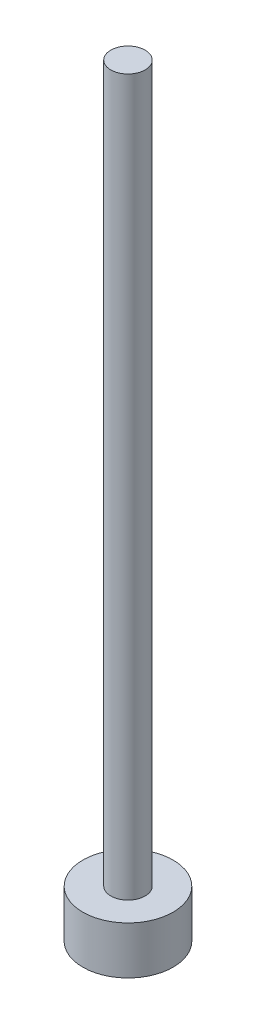
ISO-10303-21;
HEADER;
FILE_DESCRIPTION(('STEP AP214'),'2;1');
FILE_NAME('part.step','',(''),(''),'','','');
FILE_SCHEMA(('AUTOMOTIVE_DESIGN { 1 0 10303 214 1 1 1 1 }'));
ENDSEC;
DATA;
#1=APPLICATION_CONTEXT('core data for automotive mechanical design processes');
#2=APPLICATION_PROTOCOL_DEFINITION('international standard','automotive_design',2000,#1);
#3=PRODUCT_CONTEXT('',#1,'mechanical');
#4=PRODUCT('Part','Part','',(#3));
#5=PRODUCT_RELATED_PRODUCT_CATEGORY('part','',(#4));
#6=PRODUCT_DEFINITION_FORMATION('','',#4);
#7=PRODUCT_DEFINITION_CONTEXT('part definition',#1,'design');
#8=PRODUCT_DEFINITION('design','',#6,#7);
#9=PRODUCT_DEFINITION_SHAPE('','',#8);
#10=(LENGTH_UNIT() NAMED_UNIT(*) SI_UNIT(.MILLI.,.METRE.));
#11=(NAMED_UNIT(*) PLANE_ANGLE_UNIT() SI_UNIT($,.RADIAN.));
#12=(NAMED_UNIT(*) SI_UNIT($,.STERADIAN.) SOLID_ANGLE_UNIT());
#13=UNCERTAINTY_MEASURE_WITH_UNIT(LENGTH_MEASURE(1.E-05),#10,'distance_accuracy_value','');
#14=(GEOMETRIC_REPRESENTATION_CONTEXT(3) GLOBAL_UNCERTAINTY_ASSIGNED_CONTEXT((#13)) GLOBAL_UNIT_ASSIGNED_CONTEXT((#10,
#11,#12)) REPRESENTATION_CONTEXT('',''));
#15=CARTESIAN_POINT('',(0.,0.,0.));
#16=DIRECTION('',(0.,0.,1.));
#17=DIRECTION('',(1.,0.,0.));
#18=AXIS2_PLACEMENT_3D('',#15,#16,#17);
#19=CARTESIAN_POINT('',(0.,3.,0.));
#20=DIRECTION('',(0.,-1.,0.));
#21=DIRECTION('',(0.,0.,-1.));
#22=AXIS2_PLACEMENT_3D('',#19,#20,#21);
#23=CYLINDRICAL_SURFACE('',#22,2.84);
#24=CARTESIAN_POINT('',(0.,3.,0.));
#25=DIRECTION('',(0.,1.,0.));
#26=DIRECTION('',(0.,0.,1.));
#27=AXIS2_PLACEMENT_3D('',#24,#25,#26);
#28=CIRCLE('',#27,2.84);
#29=CARTESIAN_POINT('',(0.,3.,2.84));
#30=VERTEX_POINT('',#29);
#31=EDGE_CURVE('E42',#30,#30,#28,.T.);
#32=ORIENTED_EDGE('',*,*,#31,.F.);
#33=EDGE_LOOP('',(#32));
#34=FACE_BOUND('',#33,.T.);
#35=CARTESIAN_POINT('',(0.,0.,0.));
#36=DIRECTION('',(0.,1.,0.));
#37=DIRECTION('',(0.,0.,1.));
#38=AXIS2_PLACEMENT_3D('',#35,#36,#37);
#39=CIRCLE('',#38,2.84);
#40=CARTESIAN_POINT('',(0.,0.,2.84));
#41=VERTEX_POINT('',#40);
#42=EDGE_CURVE('E37',#41,#41,#39,.T.);
#43=ORIENTED_EDGE('',*,*,#42,.T.);
#44=EDGE_LOOP('',(#43));
#45=FACE_BOUND('',#44,.T.);
#46=ADVANCED_FACE('F34',(#34,#45),#23,.T.);
#47=CARTESIAN_POINT('',(0.,3.,0.));
#48=DIRECTION('',(0.,1.,0.));
#49=DIRECTION('',(0.,0.,1.));
#50=AXIS2_PLACEMENT_3D('',#47,#48,#49);
#51=PLANE('',#50);
#52=CARTESIAN_POINT('',(0.,3.,0.));
#53=DIRECTION('',(0.,1.,0.));
#54=DIRECTION('',(0.,0.,1.));
#55=AXIS2_PLACEMENT_3D('',#52,#53,#54);
#56=CIRCLE('',#55,1.07969664843992);
#57=CARTESIAN_POINT('',(0.,3.,-1.07969664843992));
#58=VERTEX_POINT('',#57);
#59=EDGE_CURVE('E11',#58,#58,#56,.T.);
#60=ORIENTED_EDGE('',*,*,#59,.F.);
#61=EDGE_LOOP('',(#60));
#62=FACE_BOUND('',#61,.T.);
#63=ORIENTED_EDGE('',*,*,#31,.T.);
#64=EDGE_LOOP('',(#63));
#65=FACE_BOUND('',#64,.T.);
#66=ADVANCED_FACE('F154',(#62,#65),#51,.T.);
#67=CARTESIAN_POINT('',(0.,0.,0.));
#68=DIRECTION('',(0.,1.,0.));
#69=DIRECTION('',(0.,0.,1.));
#70=AXIS2_PLACEMENT_3D('',#67,#68,#69);
#71=PLANE('',#70);
#72=DIRECTION('',(-0.5,0.,0.866025403784438));
#73=VECTOR('',#72,1.);
#74=CARTESIAN_POINT('',(1.65122176988233,0.,0.));
#75=LINE('',#74,#73);
#76=CARTESIAN_POINT('',(1.65122176988233,0.,0.));
#77=VERTEX_POINT('',#76);
#78=CARTESIAN_POINT('',(0.825610884941164,0.,1.43));
#79=VERTEX_POINT('',#78);
#80=EDGE_CURVE('E124',#77,#79,#75,.T.);
#81=ORIENTED_EDGE('',*,*,#80,.F.);
#82=DIRECTION('',(0.5,0.,0.866025403784439));
#83=VECTOR('',#82,1.);
#84=CARTESIAN_POINT('',(0.825610884941165,0.,-1.43));
#85=LINE('',#84,#83);
#86=CARTESIAN_POINT('',(0.825610884941165,0.,-1.43));
#87=VERTEX_POINT('',#86);
#88=EDGE_CURVE('E50',#87,#77,#85,.T.);
#89=ORIENTED_EDGE('',*,*,#88,.F.);
#90=DIRECTION('',(1.,0.,0.));
#91=VECTOR('',#90,1.);
#92=CARTESIAN_POINT('',(-0.825610884941164,0.,-1.43));
#93=LINE('',#92,#91);
#94=CARTESIAN_POINT('',(-0.825610884941164,0.,-1.43));
#95=VERTEX_POINT('',#94);
#96=EDGE_CURVE('E133',#95,#87,#93,.T.);
#97=ORIENTED_EDGE('',*,*,#96,.F.);
#98=DIRECTION('',(0.5,0.,-0.866025403784439));
#99=VECTOR('',#98,1.);
#100=CARTESIAN_POINT('',(-1.65122176988233,0.,0.));
#101=LINE('',#100,#99);
#102=CARTESIAN_POINT('',(-1.65122176988233,0.,0.));
#103=VERTEX_POINT('',#102);
#104=EDGE_CURVE('E131',#103,#95,#101,.T.);
#105=ORIENTED_EDGE('',*,*,#104,.F.);
#106=DIRECTION('',(-0.5,0.,-0.866025403784439));
#107=VECTOR('',#106,1.);
#108=CARTESIAN_POINT('',(-0.825610884941164,0.,1.43));
#109=LINE('',#108,#107);
#110=CARTESIAN_POINT('',(-0.825610884941164,0.,1.43));
#111=VERTEX_POINT('',#110);
#112=EDGE_CURVE('E98',#111,#103,#109,.T.);
#113=ORIENTED_EDGE('',*,*,#112,.F.);
#114=DIRECTION('',(-1.,0.,0.));
#115=VECTOR('',#114,1.);
#116=CARTESIAN_POINT('',(0.825610884941164,0.,1.43));
#117=LINE('',#116,#115);
#118=EDGE_CURVE('E127',#79,#111,#117,.T.);
#119=ORIENTED_EDGE('',*,*,#118,.F.);
#120=EDGE_LOOP('',(#81,#89,#97,#105,#113,#119));
#121=FACE_BOUND('',#120,.T.);
#122=ORIENTED_EDGE('',*,*,#42,.F.);
#123=EDGE_LOOP('',(#122));
#124=FACE_BOUND('',#123,.T.);
#125=ADVANCED_FACE('F151',(#121,#124),#71,.F.);
#126=CARTESIAN_POINT('',(0.,48.,0.));
#127=DIRECTION('',(0.,-1.,0.));
#128=DIRECTION('',(0.,0.,-1.));
#129=AXIS2_PLACEMENT_3D('',#126,#127,#128);
#130=CYLINDRICAL_SURFACE('',#129,1.07969664843992);
#131=CARTESIAN_POINT('',(0.,48.,0.));
#132=DIRECTION('',(0.,1.,0.));
#133=DIRECTION('',(0.,0.,1.));
#134=AXIS2_PLACEMENT_3D('',#131,#132,#133);
#135=CIRCLE('',#134,1.07969664843992);
#136=CARTESIAN_POINT('',(0.,48.,-1.07969664843992));
#137=VERTEX_POINT('',#136);
#138=EDGE_CURVE('E137',#137,#137,#135,.T.);
#139=CARTESIAN_POINT('',(0.,48.,-1.07969664843992));
#140=CARTESIAN_POINT('',(0.,47.53125,-1.07969664843992));
#141=CARTESIAN_POINT('',(0.,47.0625,-1.07969664843992));
#142=CARTESIAN_POINT('',(0.,46.125,-1.07969664843992));
#143=CARTESIAN_POINT('',(0.,45.65625,-1.07969664843992));
#144=CARTESIAN_POINT('',(0.,44.71875,-1.07969664843992));
#145=CARTESIAN_POINT('',(0.,44.25,-1.07969664843992));
#146=CARTESIAN_POINT('',(0.,43.3125,-1.07969664843992));
#147=CARTESIAN_POINT('',(0.,42.84375,-1.07969664843992));
#148=CARTESIAN_POINT('',(0.,41.90625,-1.07969664843992));
#149=CARTESIAN_POINT('',(0.,41.4375,-1.07969664843992));
#150=CARTESIAN_POINT('',(0.,40.5,-1.07969664843992));
#151=CARTESIAN_POINT('',(0.,40.03125,-1.07969664843992));
#152=CARTESIAN_POINT('',(0.,39.09375,-1.07969664843992));
#153=CARTESIAN_POINT('',(0.,38.625,-1.07969664843992));
#154=CARTESIAN_POINT('',(0.,37.6875,-1.07969664843992));
#155=CARTESIAN_POINT('',(0.,37.21875,-1.07969664843992));
#156=CARTESIAN_POINT('',(0.,36.28125,-1.07969664843992));
#157=CARTESIAN_POINT('',(0.,35.8125,-1.07969664843992));
#158=CARTESIAN_POINT('',(0.,34.875,-1.07969664843992));
#159=CARTESIAN_POINT('',(0.,34.40625,-1.07969664843992));
#160=CARTESIAN_POINT('',(0.,33.46875,-1.07969664843992));
#161=CARTESIAN_POINT('',(0.,33.,-1.07969664843992));
#162=CARTESIAN_POINT('',(0.,32.0625,-1.07969664843992));
#163=CARTESIAN_POINT('',(0.,31.59375,-1.07969664843992));
#164=CARTESIAN_POINT('',(0.,30.65625,-1.07969664843992));
#165=CARTESIAN_POINT('',(0.,30.1875,-1.07969664843992));
#166=CARTESIAN_POINT('',(0.,29.25,-1.07969664843992));
#167=CARTESIAN_POINT('',(0.,28.78125,-1.07969664843992));
#168=CARTESIAN_POINT('',(0.,27.84375,-1.07969664843992));
#169=CARTESIAN_POINT('',(0.,27.375,-1.07969664843992));
#170=CARTESIAN_POINT('',(0.,26.4375,-1.07969664843992));
#171=CARTESIAN_POINT('',(0.,25.96875,-1.07969664843992));
#172=CARTESIAN_POINT('',(0.,25.03125,-1.07969664843992));
#173=CARTESIAN_POINT('',(0.,24.5625,-1.07969664843992));
#174=CARTESIAN_POINT('',(0.,23.625,-1.07969664843992));
#175=CARTESIAN_POINT('',(0.,23.15625,-1.07969664843992));
#176=CARTESIAN_POINT('',(0.,22.21875,-1.07969664843992));
#177=CARTESIAN_POINT('',(0.,21.75,-1.07969664843992));
#178=CARTESIAN_POINT('',(0.,20.8125,-1.07969664843992));
#179=CARTESIAN_POINT('',(0.,20.34375,-1.07969664843992));
#180=CARTESIAN_POINT('',(0.,19.40625,-1.07969664843992));
#181=CARTESIAN_POINT('',(0.,18.9375,-1.07969664843992));
#182=CARTESIAN_POINT('',(0.,18.,-1.07969664843992));
#183=CARTESIAN_POINT('',(0.,17.53125,-1.07969664843992));
#184=CARTESIAN_POINT('',(0.,16.59375,-1.07969664843992));
#185=CARTESIAN_POINT('',(0.,16.125,-1.07969664843992));
#186=CARTESIAN_POINT('',(0.,15.1875,-1.07969664843992));
#187=CARTESIAN_POINT('',(0.,14.71875,-1.07969664843992));
#188=CARTESIAN_POINT('',(0.,13.78125,-1.07969664843992));
#189=CARTESIAN_POINT('',(0.,13.3125,-1.07969664843992));
#190=CARTESIAN_POINT('',(0.,12.375,-1.07969664843992));
#191=CARTESIAN_POINT('',(0.,11.90625,-1.07969664843992));
#192=CARTESIAN_POINT('',(0.,10.96875,-1.07969664843992));
#193=CARTESIAN_POINT('',(0.,10.5,-1.07969664843992));
#194=CARTESIAN_POINT('',(0.,9.5625,-1.07969664843992));
#195=CARTESIAN_POINT('',(0.,9.09375,-1.07969664843992));
#196=CARTESIAN_POINT('',(0.,8.15625,-1.07969664843992));
#197=CARTESIAN_POINT('',(0.,7.6875,-1.07969664843992));
#198=CARTESIAN_POINT('',(0.,6.75,-1.07969664843992));
#199=CARTESIAN_POINT('',(0.,6.28125,-1.07969664843992));
#200=CARTESIAN_POINT('',(0.,5.34375,-1.07969664843992));
#201=CARTESIAN_POINT('',(0.,4.87499999999999,-1.07969664843992));
#202=CARTESIAN_POINT('',(0.,3.93749999999999,-1.07969664843992));
#203=CARTESIAN_POINT('',(0.,3.46875,-1.07969664843992));
#204=CARTESIAN_POINT('',(0.,3.,-1.07969664843992));
#205=B_SPLINE_CURVE_WITH_KNOTS('',3,(#139,#140,#141,#142,#143,#144,#145,#146,#147,#148,#149,
#150,#151,#152,#153,#154,#155,#156,#157,#158,#159,#160,#161,#162,#163,#164,#165,#166,#167,#168,
#169,#170,#171,#172,#173,#174,#175,#176,#177,#178,#179,#180,#181,#182,#183,#184,#185,#186,#187,
#188,#189,#190,#191,#192,#193,#194,#195,#196,#197,#198,#199,#200,#201,#202,#203,#204),
.UNSPECIFIED.,.F.,.F.,(4,2,2,2,2,2,2,2,2,2,2,2,2,2,2,2,2,2,2,2,2,2,2,2,2,2,2,2,2,2,2,2,4),(0.,
1.40625,2.8125,4.21875000000001,5.62500000000001,7.03125,8.4375,9.84375000000001,11.25,12.65625,
14.0625,15.46875,16.875,18.28125,19.6875,21.09375,22.5,23.90625,25.3125,26.71875,28.125,
29.53125,30.9375,32.34375,33.75,35.15625,36.5625,37.96875,39.375,40.78125,42.1875,43.59375,45.),.UNSPECIFIED.);
#206=EDGE_CURVE('BSEAM153',#137,#58,#205,.T.);
#207=ORIENTED_EDGE('',*,*,#138,.F.);
#208=ORIENTED_EDGE('',*,*,#59,.T.);
#209=ORIENTED_EDGE('',*,*,#206,.T.);
#210=ORIENTED_EDGE('',*,*,#206,.F.);
#211=EDGE_LOOP('',(#207,#209,#208,#210));
#212=FACE_BOUND('',#211,.T.);
#213=ADVANCED_FACE('F153',(#212),#130,.T.);
#214=CARTESIAN_POINT('',(0.,48.,0.));
#215=DIRECTION('',(0.,1.,0.));
#216=DIRECTION('',(0.,0.,1.));
#217=AXIS2_PLACEMENT_3D('',#214,#215,#216);
#218=PLANE('',#217);
#219=ORIENTED_EDGE('',*,*,#138,.T.);
#220=EDGE_LOOP('',(#219));
#221=FACE_BOUND('',#220,.T.);
#222=ADVANCED_FACE('F160',(#221),#218,.T.);
#223=CARTESIAN_POINT('',(0.825610884941165,1.4,-1.43));
#224=DIRECTION('',(0.866025403784439,0.,-0.5));
#225=DIRECTION('',(-0.5,0.,-0.866025403784439));
#226=AXIS2_PLACEMENT_3D('',#223,#224,#225);
#227=PLANE('',#226);
#228=ORIENTED_EDGE('',*,*,#88,.T.);
#229=DIRECTION('',(0.,-1.,0.));
#230=VECTOR('',#229,1.);
#231=CARTESIAN_POINT('',(1.65122176988233,1.4,0.));
#232=LINE('',#231,#230);
#233=CARTESIAN_POINT('',(1.65122176988233,1.4,0.));
#234=VERTEX_POINT('',#233);
#235=EDGE_CURVE('E80',#234,#77,#232,.T.);
#236=ORIENTED_EDGE('',*,*,#235,.F.);
#237=DIRECTION('',(0.5,0.,0.866025403784439));
#238=VECTOR('',#237,1.);
#239=CARTESIAN_POINT('',(0.825610884941165,1.4,-1.43));
#240=LINE('',#239,#238);
#241=CARTESIAN_POINT('',(0.825610884941165,1.4,-1.43));
#242=VERTEX_POINT('',#241);
#243=EDGE_CURVE('E135',#242,#234,#240,.T.);
#244=ORIENTED_EDGE('',*,*,#243,.F.);
#245=DIRECTION('',(0.,-1.,0.));
#246=VECTOR('',#245,1.);
#247=CARTESIAN_POINT('',(0.825610884941165,1.4,-1.43));
#248=LINE('',#247,#246);
#249=EDGE_CURVE('E58',#242,#87,#248,.T.);
#250=ORIENTED_EDGE('',*,*,#249,.T.);
#251=EDGE_LOOP('',(#228,#236,#244,#250));
#252=FACE_BOUND('',#251,.T.);
#253=ADVANCED_FACE('F189',(#252),#227,.F.);
#254=CARTESIAN_POINT('',(-0.825610884941164,1.4,-1.43));
#255=DIRECTION('',(0.,0.,-1.));
#256=DIRECTION('',(-1.,0.,0.));
#257=AXIS2_PLACEMENT_3D('',#254,#255,#256);
#258=PLANE('',#257);
#259=ORIENTED_EDGE('',*,*,#96,.T.);
#260=ORIENTED_EDGE('',*,*,#249,.F.);
#261=DIRECTION('',(1.,0.,0.));
#262=VECTOR('',#261,1.);
#263=CARTESIAN_POINT('',(-0.825610884941164,1.4,-1.43));
#264=LINE('',#263,#262);
#265=CARTESIAN_POINT('',(-0.825610884941164,1.4,-1.43));
#266=VERTEX_POINT('',#265);
#267=EDGE_CURVE('E110',#266,#242,#264,.T.);
#268=ORIENTED_EDGE('',*,*,#267,.F.);
#269=DIRECTION('',(0.,-1.,0.));
#270=VECTOR('',#269,1.);
#271=CARTESIAN_POINT('',(-0.825610884941164,1.4,-1.43));
#272=LINE('',#271,#270);
#273=EDGE_CURVE('E102',#266,#95,#272,.T.);
#274=ORIENTED_EDGE('',*,*,#273,.T.);
#275=EDGE_LOOP('',(#259,#260,#268,#274));
#276=FACE_BOUND('',#275,.T.);
#277=ADVANCED_FACE('F203',(#276),#258,.F.);
#278=CARTESIAN_POINT('',(-1.65122176988233,1.4,0.));
#279=DIRECTION('',(-0.866025403784438,0.,-0.5));
#280=DIRECTION('',(-0.5,0.,0.866025403784439));
#281=AXIS2_PLACEMENT_3D('',#278,#279,#280);
#282=PLANE('',#281);
#283=ORIENTED_EDGE('',*,*,#104,.T.);
#284=ORIENTED_EDGE('',*,*,#273,.F.);
#285=DIRECTION('',(0.5,0.,-0.866025403784439));
#286=VECTOR('',#285,1.);
#287=CARTESIAN_POINT('',(-1.65122176988233,1.4,0.));
#288=LINE('',#287,#286);
#289=CARTESIAN_POINT('',(-1.65122176988233,1.4,0.));
#290=VERTEX_POINT('',#289);
#291=EDGE_CURVE('E106',#290,#266,#288,.T.);
#292=ORIENTED_EDGE('',*,*,#291,.F.);
#293=DIRECTION('',(0.,-1.,0.));
#294=VECTOR('',#293,1.);
#295=CARTESIAN_POINT('',(-1.65122176988233,1.4,0.));
#296=LINE('',#295,#294);
#297=EDGE_CURVE('E91',#290,#103,#296,.T.);
#298=ORIENTED_EDGE('',*,*,#297,.T.);
#299=EDGE_LOOP('',(#283,#284,#292,#298));
#300=FACE_BOUND('',#299,.T.);
#301=ADVANCED_FACE('F107',(#300),#282,.F.);
#302=CARTESIAN_POINT('',(-0.825610884941164,1.4,1.43));
#303=DIRECTION('',(-0.866025403784439,0.,0.5));
#304=DIRECTION('',(0.5,0.,0.866025403784439));
#305=AXIS2_PLACEMENT_3D('',#302,#303,#304);
#306=PLANE('',#305);
#307=ORIENTED_EDGE('',*,*,#112,.T.);
#308=ORIENTED_EDGE('',*,*,#297,.F.);
#309=DIRECTION('',(-0.5,0.,-0.866025403784439));
#310=VECTOR('',#309,1.);
#311=CARTESIAN_POINT('',(-0.825610884941164,1.4,1.43));
#312=LINE('',#311,#310);
#313=CARTESIAN_POINT('',(-0.825610884941164,1.4,1.43));
#314=VERTEX_POINT('',#313);
#315=EDGE_CURVE('E95',#314,#290,#312,.T.);
#316=ORIENTED_EDGE('',*,*,#315,.F.);
#317=DIRECTION('',(0.,-1.,0.));
#318=VECTOR('',#317,1.);
#319=CARTESIAN_POINT('',(-0.825610884941164,1.4,1.43));
#320=LINE('',#319,#318);
#321=EDGE_CURVE('E103',#314,#111,#320,.T.);
#322=ORIENTED_EDGE('',*,*,#321,.T.);
#323=EDGE_LOOP('',(#307,#308,#316,#322));
#324=FACE_BOUND('',#323,.T.);
#325=ADVANCED_FACE('F93',(#324),#306,.F.);
#326=CARTESIAN_POINT('',(0.825610884941164,1.4,1.43));
#327=DIRECTION('',(0.,0.,1.));
#328=DIRECTION('',(1.,0.,0.));
#329=AXIS2_PLACEMENT_3D('',#326,#327,#328);
#330=PLANE('',#329);
#331=ORIENTED_EDGE('',*,*,#118,.T.);
#332=ORIENTED_EDGE('',*,*,#321,.F.);
#333=DIRECTION('',(-1.,0.,0.));
#334=VECTOR('',#333,1.);
#335=CARTESIAN_POINT('',(0.825610884941164,1.4,1.43));
#336=LINE('',#335,#334);
#337=CARTESIAN_POINT('',(0.825610884941164,1.4,1.43));
#338=VERTEX_POINT('',#337);
#339=EDGE_CURVE('E116',#338,#314,#336,.T.);
#340=ORIENTED_EDGE('',*,*,#339,.F.);
#341=DIRECTION('',(0.,-1.,0.));
#342=VECTOR('',#341,1.);
#343=CARTESIAN_POINT('',(0.825610884941164,1.4,1.43));
#344=LINE('',#343,#342);
#345=EDGE_CURVE('E140',#338,#79,#344,.T.);
#346=ORIENTED_EDGE('',*,*,#345,.T.);
#347=EDGE_LOOP('',(#331,#332,#340,#346));
#348=FACE_BOUND('',#347,.T.);
#349=ADVANCED_FACE('F228',(#348),#330,.F.);
#350=CARTESIAN_POINT('',(1.65122176988233,1.4,0.));
#351=DIRECTION('',(0.866025403784438,0.,0.5));
#352=DIRECTION('',(0.5,0.,-0.866025403784438));
#353=AXIS2_PLACEMENT_3D('',#350,#351,#352);
#354=PLANE('',#353);
#355=ORIENTED_EDGE('',*,*,#80,.T.);
#356=ORIENTED_EDGE('',*,*,#345,.F.);
#357=DIRECTION('',(-0.5,0.,0.866025403784438));
#358=VECTOR('',#357,1.);
#359=CARTESIAN_POINT('',(1.65122176988233,1.4,0.));
#360=LINE('',#359,#358);
#361=EDGE_CURVE('E118',#234,#338,#360,.T.);
#362=ORIENTED_EDGE('',*,*,#361,.F.);
#363=ORIENTED_EDGE('',*,*,#235,.T.);
#364=EDGE_LOOP('',(#355,#356,#362,#363));
#365=FACE_BOUND('',#364,.T.);
#366=ADVANCED_FACE('F237',(#365),#354,.F.);
#367=CARTESIAN_POINT('',(0.,1.4,0.));
#368=DIRECTION('',(0.,-1.,0.));
#369=DIRECTION('',(0.,0.,-1.));
#370=AXIS2_PLACEMENT_3D('',#367,#368,#369);
#371=PLANE('',#370);
#372=ORIENTED_EDGE('',*,*,#243,.T.);
#373=ORIENTED_EDGE('',*,*,#361,.T.);
#374=ORIENTED_EDGE('',*,*,#339,.T.);
#375=ORIENTED_EDGE('',*,*,#315,.T.);
#376=ORIENTED_EDGE('',*,*,#291,.T.);
#377=ORIENTED_EDGE('',*,*,#267,.T.);
#378=EDGE_LOOP('',(#372,#373,#374,#375,#376,#377));
#379=FACE_BOUND('',#378,.T.);
#380=ADVANCED_FACE('F113',(#379),#371,.T.);
#381=CLOSED_SHELL('',(#46,#66,#125,#213,#222,#253,#277,#301,#325,#349,#366,#380));
#382=MANIFOLD_SOLID_BREP('B2',#381);
#383=ADVANCED_BREP_SHAPE_REPRESENTATION('',(#18,#382),#14);
#384=SHAPE_DEFINITION_REPRESENTATION(#9,#383);
ENDSEC;
END-ISO-10303-21;
